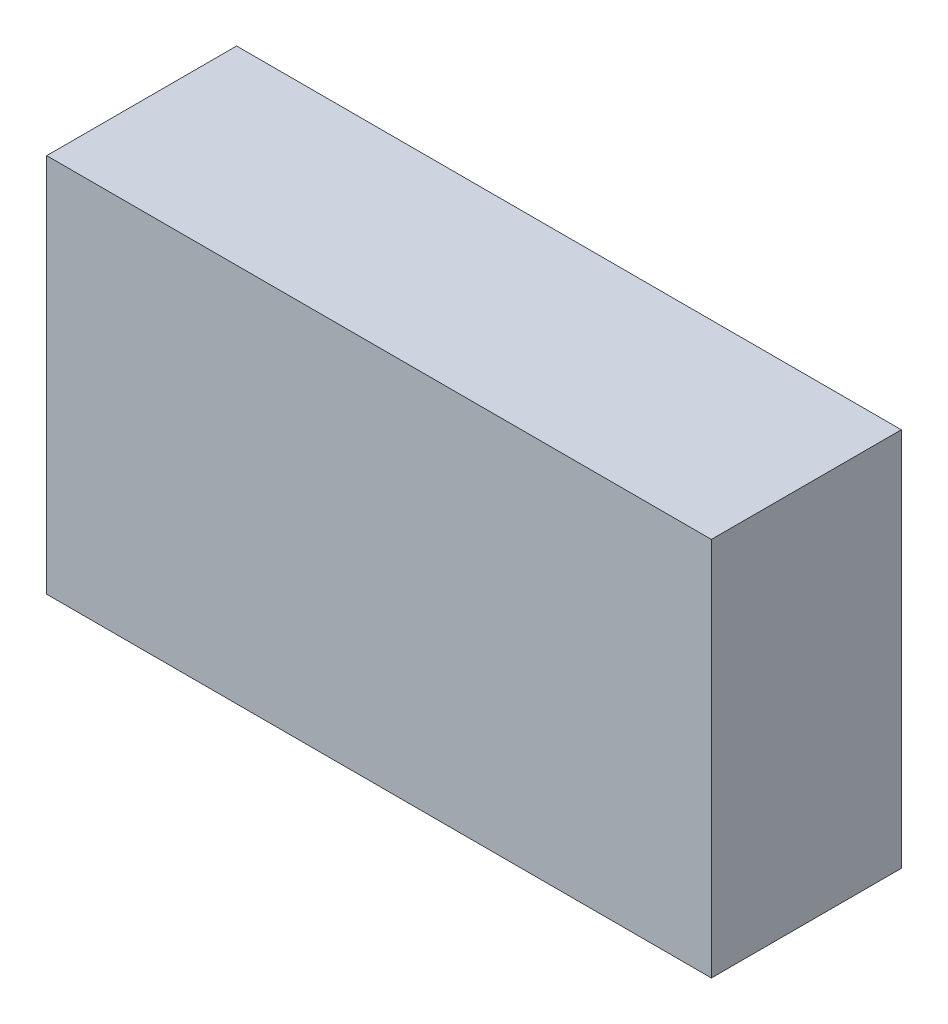
ISO-10303-21;
HEADER;
FILE_DESCRIPTION(('STEP AP214'),'2;1');
FILE_NAME('part.step','',(''),(''),'','','');
FILE_SCHEMA(('AUTOMOTIVE_DESIGN { 1 0 10303 214 1 1 1 1 }'));
ENDSEC;
DATA;
#1=APPLICATION_CONTEXT('core data for automotive mechanical design processes');
#2=APPLICATION_PROTOCOL_DEFINITION('international standard','automotive_design',2000,#1);
#3=PRODUCT_CONTEXT('',#1,'mechanical');
#4=PRODUCT('Part','Part','',(#3));
#5=PRODUCT_RELATED_PRODUCT_CATEGORY('part','',(#4));
#6=PRODUCT_DEFINITION_FORMATION('','',#4);
#7=PRODUCT_DEFINITION_CONTEXT('part definition',#1,'design');
#8=PRODUCT_DEFINITION('design','',#6,#7);
#9=PRODUCT_DEFINITION_SHAPE('','',#8);
#10=(LENGTH_UNIT() NAMED_UNIT(*) SI_UNIT(.MILLI.,.METRE.));
#11=(NAMED_UNIT(*) PLANE_ANGLE_UNIT() SI_UNIT($,.RADIAN.));
#12=(NAMED_UNIT(*) SI_UNIT($,.STERADIAN.) SOLID_ANGLE_UNIT());
#13=UNCERTAINTY_MEASURE_WITH_UNIT(LENGTH_MEASURE(1.E-05),#10,'distance_accuracy_value','');
#14=(GEOMETRIC_REPRESENTATION_CONTEXT(3) GLOBAL_UNCERTAINTY_ASSIGNED_CONTEXT((#13)) GLOBAL_UNIT_ASSIGNED_CONTEXT((#10,
#11,#12)) REPRESENTATION_CONTEXT('',''));
#15=CARTESIAN_POINT('',(0.,0.,0.));
#16=DIRECTION('',(0.,0.,1.));
#17=DIRECTION('',(1.,0.,0.));
#18=AXIS2_PLACEMENT_3D('',#15,#16,#17);
#19=CARTESIAN_POINT('',(-1.83625730994177,1999.22807017544,1000.));
#20=DIRECTION('',(1.,0.,0.));
#21=DIRECTION('',(0.,1.,0.));
#22=AXIS2_PLACEMENT_3D('',#19,#20,#21);
#23=PLANE('',#22);
#24=DIRECTION('',(0.,-1.,0.));
#25=VECTOR('',#24,1.);
#26=CARTESIAN_POINT('',(-1.83625730994177,1999.22807017544,0.));
#27=LINE('',#26,#25);
#28=CARTESIAN_POINT('',(-1.83625730994177,1999.22807017544,0.));
#29=VERTEX_POINT('',#28);
#30=CARTESIAN_POINT('',(-1.83625730994152,-0.771929824561403,0.));
#31=VERTEX_POINT('',#30);
#32=EDGE_CURVE('E107',#29,#31,#27,.T.);
#33=ORIENTED_EDGE('',*,*,#32,.T.);
#34=DIRECTION('',(0.,0.,-1.));
#35=VECTOR('',#34,1.);
#36=CARTESIAN_POINT('',(-1.83625730994152,-0.771929824561403,1000.));
#37=LINE('',#36,#35);
#38=CARTESIAN_POINT('',(-1.83625730994152,-0.771929824561403,1000.));
#39=VERTEX_POINT('',#38);
#40=EDGE_CURVE('E11',#39,#31,#37,.T.);
#41=ORIENTED_EDGE('',*,*,#40,.F.);
#42=DIRECTION('',(0.,-1.,0.));
#43=VECTOR('',#42,1.);
#44=CARTESIAN_POINT('',(-1.83625730994177,1999.22807017544,1000.));
#45=LINE('',#44,#43);
#46=CARTESIAN_POINT('',(-1.83625730994177,1999.22807017544,1000.));
#47=VERTEX_POINT('',#46);
#48=EDGE_CURVE('E91',#47,#39,#45,.T.);
#49=ORIENTED_EDGE('',*,*,#48,.F.);
#50=DIRECTION('',(0.,0.,-1.));
#51=VECTOR('',#50,1.);
#52=CARTESIAN_POINT('',(-1.83625730994177,1999.22807017544,1000.));
#53=LINE('',#52,#51);
#54=EDGE_CURVE('E103',#47,#29,#53,.T.);
#55=ORIENTED_EDGE('',*,*,#54,.T.);
#56=EDGE_LOOP('',(#33,#41,#49,#55));
#57=FACE_BOUND('',#56,.T.);
#58=ADVANCED_FACE('F39',(#57),#23,.F.);
#59=CARTESIAN_POINT('',(-1.83625730994152,-0.771929824561403,1000.));
#60=DIRECTION('',(0.,1.,0.));
#61=DIRECTION('',(0.,0.,1.));
#62=AXIS2_PLACEMENT_3D('',#59,#60,#61);
#63=PLANE('',#62);
#64=DIRECTION('',(1.,0.,0.));
#65=VECTOR('',#64,1.);
#66=CARTESIAN_POINT('',(-1.83625730994152,-0.771929824561403,0.));
#67=LINE('',#66,#65);
#68=CARTESIAN_POINT('',(3498.16374269006,-0.771929824561403,0.));
#69=VERTEX_POINT('',#68);
#70=EDGE_CURVE('E96',#31,#69,#67,.T.);
#71=ORIENTED_EDGE('',*,*,#70,.T.);
#72=DIRECTION('',(0.,0.,-1.));
#73=VECTOR('',#72,1.);
#74=CARTESIAN_POINT('',(3498.16374269006,-0.771929824561403,1000.));
#75=LINE('',#74,#73);
#76=CARTESIAN_POINT('',(3498.16374269006,-0.771929824561403,1000.));
#77=VERTEX_POINT('',#76);
#78=EDGE_CURVE('E48',#77,#69,#75,.T.);
#79=ORIENTED_EDGE('',*,*,#78,.F.);
#80=DIRECTION('',(1.,0.,0.));
#81=VECTOR('',#80,1.);
#82=CARTESIAN_POINT('',(-1.83625730994152,-0.771929824561403,1000.));
#83=LINE('',#82,#81);
#84=EDGE_CURVE('E86',#39,#77,#83,.T.);
#85=ORIENTED_EDGE('',*,*,#84,.F.);
#86=ORIENTED_EDGE('',*,*,#40,.T.);
#87=EDGE_LOOP('',(#71,#79,#85,#86));
#88=FACE_BOUND('',#87,.T.);
#89=ADVANCED_FACE('F95',(#88),#63,.F.);
#90=CARTESIAN_POINT('',(3498.16374269006,1999.22807017544,1000.));
#91=DIRECTION('',(-1.,0.,0.));
#92=DIRECTION('',(0.,0.,1.));
#93=AXIS2_PLACEMENT_3D('',#90,#91,#92);
#94=PLANE('',#93);
#95=DIRECTION('',(0.,1.,0.));
#96=VECTOR('',#95,1.);
#97=CARTESIAN_POINT('',(3498.16374269006,1999.22807017544,0.));
#98=LINE('',#97,#96);
#99=CARTESIAN_POINT('',(3498.16374269006,1999.22807017544,0.));
#100=VERTEX_POINT('',#99);
#101=EDGE_CURVE('E73',#69,#100,#98,.T.);
#102=ORIENTED_EDGE('',*,*,#101,.T.);
#103=DIRECTION('',(0.,0.,-1.));
#104=VECTOR('',#103,1.);
#105=CARTESIAN_POINT('',(3498.16374269006,1999.22807017544,1000.));
#106=LINE('',#105,#104);
#107=CARTESIAN_POINT('',(3498.16374269006,1999.22807017544,1000.));
#108=VERTEX_POINT('',#107);
#109=EDGE_CURVE('E98',#108,#100,#106,.T.);
#110=ORIENTED_EDGE('',*,*,#109,.F.);
#111=DIRECTION('',(0.,1.,0.));
#112=VECTOR('',#111,1.);
#113=CARTESIAN_POINT('',(3498.16374269006,1999.22807017544,1000.));
#114=LINE('',#113,#112);
#115=EDGE_CURVE('E89',#77,#108,#114,.T.);
#116=ORIENTED_EDGE('',*,*,#115,.F.);
#117=ORIENTED_EDGE('',*,*,#78,.T.);
#118=EDGE_LOOP('',(#102,#110,#116,#117));
#119=FACE_BOUND('',#118,.T.);
#120=ADVANCED_FACE('F99',(#119),#94,.F.);
#121=CARTESIAN_POINT('',(-1.83625730994177,1999.22807017544,1000.));
#122=DIRECTION('',(0.,-1.,0.));
#123=DIRECTION('',(0.,0.,-1.));
#124=AXIS2_PLACEMENT_3D('',#121,#122,#123);
#125=PLANE('',#124);
#126=DIRECTION('',(-1.,0.,0.));
#127=VECTOR('',#126,1.);
#128=CARTESIAN_POINT('',(-1.83625730994177,1999.22807017544,0.));
#129=LINE('',#128,#127);
#130=EDGE_CURVE('E79',#100,#29,#129,.T.);
#131=ORIENTED_EDGE('',*,*,#130,.T.);
#132=ORIENTED_EDGE('',*,*,#54,.F.);
#133=DIRECTION('',(-1.,0.,0.));
#134=VECTOR('',#133,1.);
#135=CARTESIAN_POINT('',(-1.83625730994177,1999.22807017544,1000.));
#136=LINE('',#135,#134);
#137=EDGE_CURVE('E56',#108,#47,#136,.T.);
#138=ORIENTED_EDGE('',*,*,#137,.F.);
#139=ORIENTED_EDGE('',*,*,#109,.T.);
#140=EDGE_LOOP('',(#131,#132,#138,#139));
#141=FACE_BOUND('',#140,.T.);
#142=ADVANCED_FACE('F120',(#141),#125,.F.);
#143=CARTESIAN_POINT('',(0.,0.,1000.));
#144=DIRECTION('',(0.,0.,1.));
#145=DIRECTION('',(1.,0.,0.));
#146=AXIS2_PLACEMENT_3D('',#143,#144,#145);
#147=PLANE('',#146);
#148=ORIENTED_EDGE('',*,*,#48,.T.);
#149=ORIENTED_EDGE('',*,*,#84,.T.);
#150=ORIENTED_EDGE('',*,*,#115,.T.);
#151=ORIENTED_EDGE('',*,*,#137,.T.);
#152=EDGE_LOOP('',(#148,#149,#150,#151));
#153=FACE_BOUND('',#152,.T.);
#154=ADVANCED_FACE('F87',(#153),#147,.T.);
#155=CARTESIAN_POINT('',(0.,0.,0.));
#156=DIRECTION('',(0.,0.,1.));
#157=DIRECTION('',(1.,0.,0.));
#158=AXIS2_PLACEMENT_3D('',#155,#156,#157);
#159=PLANE('',#158);
#160=ORIENTED_EDGE('',*,*,#32,.F.);
#161=ORIENTED_EDGE('',*,*,#130,.F.);
#162=ORIENTED_EDGE('',*,*,#101,.F.);
#163=ORIENTED_EDGE('',*,*,#70,.F.);
#164=EDGE_LOOP('',(#160,#161,#162,#163));
#165=FACE_BOUND('',#164,.T.);
#166=ADVANCED_FACE('F123',(#165),#159,.F.);
#167=CLOSED_SHELL('',(#58,#89,#120,#142,#154,#166));
#168=MANIFOLD_SOLID_BREP('B2',#167);
#169=ADVANCED_BREP_SHAPE_REPRESENTATION('',(#18,#168),#14);
#170=SHAPE_DEFINITION_REPRESENTATION(#9,#169);
ENDSEC;
END-ISO-10303-21;
